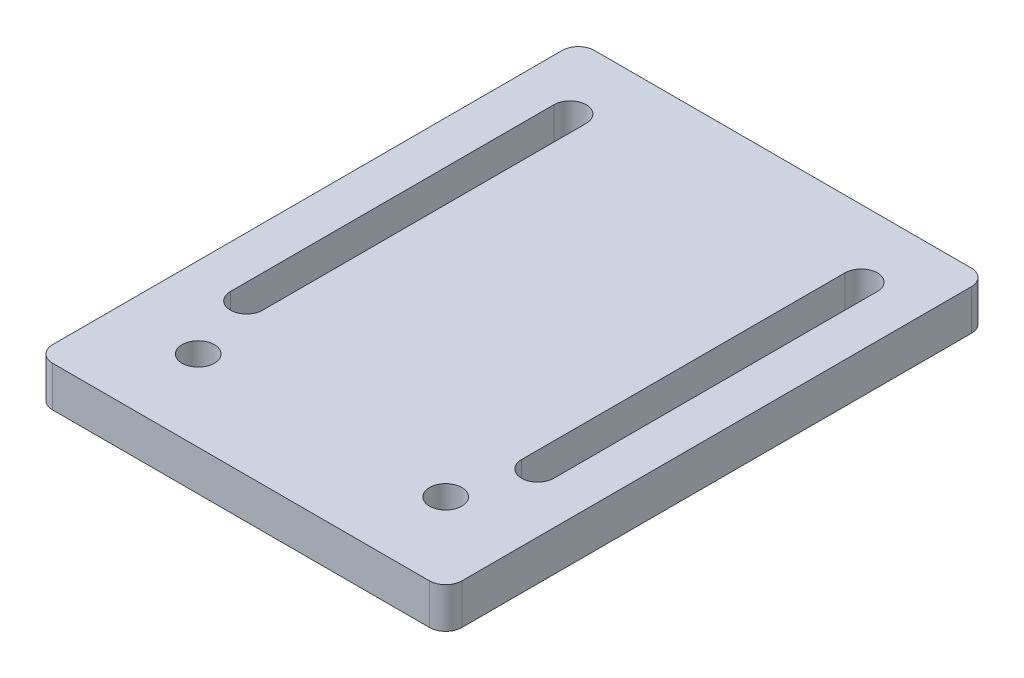
ISO-10303-21;
HEADER;
FILE_DESCRIPTION(('STEP AP214'),'2;1');
FILE_NAME('part.step','',(''),(''),'','','');
FILE_SCHEMA(('AUTOMOTIVE_DESIGN { 1 0 10303 214 1 1 1 1 }'));
ENDSEC;
DATA;
#1=APPLICATION_CONTEXT('core data for automotive mechanical design processes');
#2=APPLICATION_PROTOCOL_DEFINITION('international standard','automotive_design',2000,#1);
#3=PRODUCT_CONTEXT('',#1,'mechanical');
#4=PRODUCT('Part','Part','',(#3));
#5=PRODUCT_RELATED_PRODUCT_CATEGORY('part','',(#4));
#6=PRODUCT_DEFINITION_FORMATION('','',#4);
#7=PRODUCT_DEFINITION_CONTEXT('part definition',#1,'design');
#8=PRODUCT_DEFINITION('design','',#6,#7);
#9=PRODUCT_DEFINITION_SHAPE('','',#8);
#10=(LENGTH_UNIT() NAMED_UNIT(*) SI_UNIT(.MILLI.,.METRE.));
#11=(NAMED_UNIT(*) PLANE_ANGLE_UNIT() SI_UNIT($,.RADIAN.));
#12=(NAMED_UNIT(*) SI_UNIT($,.STERADIAN.) SOLID_ANGLE_UNIT());
#13=UNCERTAINTY_MEASURE_WITH_UNIT(LENGTH_MEASURE(1.E-05),#10,'distance_accuracy_value','');
#14=(GEOMETRIC_REPRESENTATION_CONTEXT(3) GLOBAL_UNCERTAINTY_ASSIGNED_CONTEXT((#13)) GLOBAL_UNIT_ASSIGNED_CONTEXT((#10,
#11,#12)) REPRESENTATION_CONTEXT('',''));
#15=CARTESIAN_POINT('',(0.,0.,0.));
#16=DIRECTION('',(0.,0.,1.));
#17=DIRECTION('',(1.,0.,0.));
#18=AXIS2_PLACEMENT_3D('',#15,#16,#17);
#19=CARTESIAN_POINT('',(25.3,5.,0.));
#20=DIRECTION('',(1.,0.,0.));
#21=DIRECTION('',(0.,0.,-1.));
#22=AXIS2_PLACEMENT_3D('',#19,#20,#21);
#23=PLANE('',#22);
#24=DIRECTION('',(0.,0.,1.));
#25=VECTOR('',#24,1.);
#26=CARTESIAN_POINT('',(25.3,0.,0.));
#27=LINE('',#26,#25);
#28=CARTESIAN_POINT('',(25.3,0.,-15.));
#29=VERTEX_POINT('',#28);
#30=CARTESIAN_POINT('',(25.3,0.,48.));
#31=VERTEX_POINT('',#30);
#32=EDGE_CURVE('E212',#29,#31,#27,.T.);
#33=ORIENTED_EDGE('',*,*,#32,.F.);
#34=DIRECTION('',(0.,-1.,0.));
#35=VECTOR('',#34,1.);
#36=CARTESIAN_POINT('',(25.3,5.,-15.));
#37=LINE('',#36,#35);
#38=CARTESIAN_POINT('',(25.3,5.,-15.));
#39=VERTEX_POINT('',#38);
#40=EDGE_CURVE('E274',#29,#39,#37,.F.);
#41=ORIENTED_EDGE('',*,*,#40,.T.);
#42=DIRECTION('',(0.,0.,1.));
#43=VECTOR('',#42,1.);
#44=CARTESIAN_POINT('',(25.3,5.,0.));
#45=LINE('',#44,#43);
#46=CARTESIAN_POINT('',(25.3,5.,48.));
#47=VERTEX_POINT('',#46);
#48=EDGE_CURVE('E338',#39,#47,#45,.T.);
#49=ORIENTED_EDGE('',*,*,#48,.T.);
#50=DIRECTION('',(0.,-1.,0.));
#51=VECTOR('',#50,1.);
#52=CARTESIAN_POINT('',(25.3,0.,48.));
#53=LINE('',#52,#51);
#54=EDGE_CURVE('E270',#47,#31,#53,.T.);
#55=ORIENTED_EDGE('',*,*,#54,.T.);
#56=EDGE_LOOP('',(#33,#41,#49,#55));
#57=FACE_BOUND('',#56,.T.);
#58=ADVANCED_FACE('F45',(#57),#23,.T.);
#59=CARTESIAN_POINT('',(0.,5.,-17.));
#60=DIRECTION('',(0.,0.,1.));
#61=DIRECTION('',(1.,0.,0.));
#62=AXIS2_PLACEMENT_3D('',#59,#60,#61);
#63=PLANE('',#62);
#64=DIRECTION('',(-1.,0.,0.));
#65=VECTOR('',#64,1.);
#66=CARTESIAN_POINT('',(0.,0.,-17.));
#67=LINE('',#66,#65);
#68=CARTESIAN_POINT('',(23.3,0.,-17.));
#69=VERTEX_POINT('',#68);
#70=CARTESIAN_POINT('',(-23.3,0.,-17.));
#71=VERTEX_POINT('',#70);
#72=EDGE_CURVE('E221',#69,#71,#67,.T.);
#73=ORIENTED_EDGE('',*,*,#72,.T.);
#74=DIRECTION('',(0.,-1.,0.));
#75=VECTOR('',#74,1.);
#76=CARTESIAN_POINT('',(-23.3,5.,-17.));
#77=LINE('',#76,#75);
#78=CARTESIAN_POINT('',(-23.3,5.,-17.));
#79=VERTEX_POINT('',#78);
#80=EDGE_CURVE('E255',#71,#79,#77,.F.);
#81=ORIENTED_EDGE('',*,*,#80,.T.);
#82=DIRECTION('',(-1.,0.,0.));
#83=VECTOR('',#82,1.);
#84=CARTESIAN_POINT('',(0.,5.,-17.));
#85=LINE('',#84,#83);
#86=CARTESIAN_POINT('',(23.3,5.,-17.));
#87=VERTEX_POINT('',#86);
#88=EDGE_CURVE('E342',#87,#79,#85,.T.);
#89=ORIENTED_EDGE('',*,*,#88,.F.);
#90=DIRECTION('',(0.,-1.,0.));
#91=VECTOR('',#90,1.);
#92=CARTESIAN_POINT('',(23.3,0.,-17.));
#93=LINE('',#92,#91);
#94=EDGE_CURVE('E251',#87,#69,#93,.T.);
#95=ORIENTED_EDGE('',*,*,#94,.T.);
#96=EDGE_LOOP('',(#73,#81,#89,#95));
#97=FACE_BOUND('',#96,.T.);
#98=ADVANCED_FACE('F376',(#97),#63,.F.);
#99=CARTESIAN_POINT('',(-25.3,5.,0.));
#100=DIRECTION('',(1.,0.,0.));
#101=DIRECTION('',(0.,0.,-1.));
#102=AXIS2_PLACEMENT_3D('',#99,#100,#101);
#103=PLANE('',#102);
#104=DIRECTION('',(0.,0.,1.));
#105=VECTOR('',#104,1.);
#106=CARTESIAN_POINT('',(-25.3,5.,0.));
#107=LINE('',#106,#105);
#108=CARTESIAN_POINT('',(-25.3,5.,-15.));
#109=VERTEX_POINT('',#108);
#110=CARTESIAN_POINT('',(-25.3,5.,48.));
#111=VERTEX_POINT('',#110);
#112=EDGE_CURVE('E345',#109,#111,#107,.T.);
#113=ORIENTED_EDGE('',*,*,#112,.F.);
#114=DIRECTION('',(0.,-1.,0.));
#115=VECTOR('',#114,1.);
#116=CARTESIAN_POINT('',(-25.3,5.,-15.));
#117=LINE('',#116,#115);
#118=CARTESIAN_POINT('',(-25.3,0.,-15.));
#119=VERTEX_POINT('',#118);
#120=EDGE_CURVE('E237',#109,#119,#117,.T.);
#121=ORIENTED_EDGE('',*,*,#120,.T.);
#122=DIRECTION('',(0.,0.,1.));
#123=VECTOR('',#122,1.);
#124=CARTESIAN_POINT('',(-25.3,0.,0.));
#125=LINE('',#124,#123);
#126=CARTESIAN_POINT('',(-25.3,0.,48.));
#127=VERTEX_POINT('',#126);
#128=EDGE_CURVE('E225',#119,#127,#125,.T.);
#129=ORIENTED_EDGE('',*,*,#128,.T.);
#130=DIRECTION('',(0.,-1.,0.));
#131=VECTOR('',#130,1.);
#132=CARTESIAN_POINT('',(-25.3,5.,48.));
#133=LINE('',#132,#131);
#134=EDGE_CURVE('E234',#127,#111,#133,.F.);
#135=ORIENTED_EDGE('',*,*,#134,.T.);
#136=EDGE_LOOP('',(#113,#121,#129,#135));
#137=FACE_BOUND('',#136,.T.);
#138=ADVANCED_FACE('F380',(#137),#103,.F.);
#139=CARTESIAN_POINT('',(-15.3,5.,40.));
#140=DIRECTION('',(0.,-1.,0.));
#141=DIRECTION('',(0.,0.,-1.));
#142=AXIS2_PLACEMENT_3D('',#139,#140,#141);
#143=CYLINDRICAL_SURFACE('',#142,2.);
#144=CARTESIAN_POINT('',(-15.3,5.,40.));
#145=DIRECTION('',(0.,1.,0.));
#146=DIRECTION('',(0.,0.,1.));
#147=AXIS2_PLACEMENT_3D('',#144,#145,#146);
#148=CIRCLE('',#147,2.);
#149=CARTESIAN_POINT('',(-15.3,5.,42.));
#150=VERTEX_POINT('',#149);
#151=EDGE_CURVE('E334',#150,#150,#148,.T.);
#152=ORIENTED_EDGE('',*,*,#151,.T.);
#153=EDGE_LOOP('',(#152));
#154=FACE_BOUND('',#153,.T.);
#155=CARTESIAN_POINT('',(-15.3,0.,40.));
#156=DIRECTION('',(0.,1.,0.));
#157=DIRECTION('',(0.,0.,1.));
#158=AXIS2_PLACEMENT_3D('',#155,#156,#157);
#159=CIRCLE('',#158,2.);
#160=CARTESIAN_POINT('',(-15.3,0.,42.));
#161=VERTEX_POINT('',#160);
#162=EDGE_CURVE('E206',#161,#161,#159,.T.);
#163=ORIENTED_EDGE('',*,*,#162,.F.);
#164=EDGE_LOOP('',(#163));
#165=FACE_BOUND('',#164,.T.);
#166=ADVANCED_FACE('F393',(#154,#165),#143,.F.);
#167=CARTESIAN_POINT('',(15.3,5.,40.));
#168=DIRECTION('',(0.,-1.,0.));
#169=DIRECTION('',(0.,0.,-1.));
#170=AXIS2_PLACEMENT_3D('',#167,#168,#169);
#171=CYLINDRICAL_SURFACE('',#170,2.);
#172=CARTESIAN_POINT('',(15.3,5.,40.));
#173=DIRECTION('',(0.,1.,0.));
#174=DIRECTION('',(0.,0.,1.));
#175=AXIS2_PLACEMENT_3D('',#172,#173,#174);
#176=CIRCLE('',#175,2.);
#177=CARTESIAN_POINT('',(15.3,5.,42.));
#178=VERTEX_POINT('',#177);
#179=EDGE_CURVE('E233',#178,#178,#176,.T.);
#180=ORIENTED_EDGE('',*,*,#179,.T.);
#181=EDGE_LOOP('',(#180));
#182=FACE_BOUND('',#181,.T.);
#183=CARTESIAN_POINT('',(15.3,0.,40.));
#184=DIRECTION('',(0.,1.,0.));
#185=DIRECTION('',(0.,0.,1.));
#186=AXIS2_PLACEMENT_3D('',#183,#184,#185);
#187=CIRCLE('',#186,2.);
#188=CARTESIAN_POINT('',(15.3,0.,42.));
#189=VERTEX_POINT('',#188);
#190=EDGE_CURVE('E200',#189,#189,#187,.T.);
#191=ORIENTED_EDGE('',*,*,#190,.F.);
#192=EDGE_LOOP('',(#191));
#193=FACE_BOUND('',#192,.T.);
#194=ADVANCED_FACE('F385',(#182,#193),#171,.F.);
#195=CARTESIAN_POINT('',(0.,5.,50.));
#196=DIRECTION('',(0.,0.,-1.));
#197=DIRECTION('',(-1.,0.,0.));
#198=AXIS2_PLACEMENT_3D('',#195,#196,#197);
#199=PLANE('',#198);
#200=DIRECTION('',(1.,0.,0.));
#201=VECTOR('',#200,1.);
#202=CARTESIAN_POINT('',(0.,0.,50.));
#203=LINE('',#202,#201);
#204=CARTESIAN_POINT('',(-23.3,0.,50.));
#205=VERTEX_POINT('',#204);
#206=CARTESIAN_POINT('',(23.3,0.,50.));
#207=VERTEX_POINT('',#206);
#208=EDGE_CURVE('E229',#205,#207,#203,.T.);
#209=ORIENTED_EDGE('',*,*,#208,.T.);
#210=DIRECTION('',(0.,-1.,0.));
#211=VECTOR('',#210,1.);
#212=CARTESIAN_POINT('',(23.3,5.,50.));
#213=LINE('',#212,#211);
#214=CARTESIAN_POINT('',(23.3,5.,50.));
#215=VERTEX_POINT('',#214);
#216=EDGE_CURVE('E11',#207,#215,#213,.F.);
#217=ORIENTED_EDGE('',*,*,#216,.T.);
#218=DIRECTION('',(1.,0.,0.));
#219=VECTOR('',#218,1.);
#220=CARTESIAN_POINT('',(0.,5.,50.));
#221=LINE('',#220,#219);
#222=CARTESIAN_POINT('',(-23.3,5.,50.));
#223=VERTEX_POINT('',#222);
#224=EDGE_CURVE('E215',#223,#215,#221,.T.);
#225=ORIENTED_EDGE('',*,*,#224,.F.);
#226=DIRECTION('',(0.,-1.,0.));
#227=VECTOR('',#226,1.);
#228=CARTESIAN_POINT('',(-23.3,5.,50.));
#229=LINE('',#228,#227);
#230=EDGE_CURVE('E55',#223,#205,#229,.T.);
#231=ORIENTED_EDGE('',*,*,#230,.T.);
#232=EDGE_LOOP('',(#209,#217,#225,#231));
#233=FACE_BOUND('',#232,.T.);
#234=ADVANCED_FACE('F383',(#233),#199,.F.);
#235=CARTESIAN_POINT('',(0.,5.,0.));
#236=DIRECTION('',(0.,1.,0.));
#237=DIRECTION('',(0.,0.,1.));
#238=AXIS2_PLACEMENT_3D('',#235,#236,#237);
#239=PLANE('',#238);
#240=CARTESIAN_POINT('',(18.,5.,-8.67891250614782));
#241=DIRECTION('',(0.,1.,0.));
#242=DIRECTION('',(0.,0.,1.));
#243=AXIS2_PLACEMENT_3D('',#240,#241,#242);
#244=CIRCLE('',#243,2.);
#245=CARTESIAN_POINT('',(20.,5.,-8.67891250614782));
#246=VERTEX_POINT('',#245);
#247=CARTESIAN_POINT('',(16.,5.,-8.67891250614782));
#248=VERTEX_POINT('',#247);
#249=EDGE_CURVE('E49',#246,#248,#244,.T.);
#250=ORIENTED_EDGE('',*,*,#249,.F.);
#251=DIRECTION('',(0.,0.,-1.));
#252=VECTOR('',#251,1.);
#253=CARTESIAN_POINT('',(20.,5.,-8.67891250614782));
#254=LINE('',#253,#252);
#255=CARTESIAN_POINT('',(20.,5.,31.3210874938522));
#256=VERTEX_POINT('',#255);
#257=EDGE_CURVE('E92',#256,#246,#254,.T.);
#258=ORIENTED_EDGE('',*,*,#257,.F.);
#259=CARTESIAN_POINT('',(18.,5.,31.3210874938522));
#260=DIRECTION('',(0.,1.,0.));
#261=DIRECTION('',(0.,0.,1.));
#262=AXIS2_PLACEMENT_3D('',#259,#260,#261);
#263=CIRCLE('',#262,2.);
#264=CARTESIAN_POINT('',(16.,5.,31.3210874938522));
#265=VERTEX_POINT('',#264);
#266=EDGE_CURVE('E193',#265,#256,#263,.T.);
#267=ORIENTED_EDGE('',*,*,#266,.F.);
#268=DIRECTION('',(0.,0.,1.));
#269=VECTOR('',#268,1.);
#270=CARTESIAN_POINT('',(16.,5.,-8.67891250614782));
#271=LINE('',#270,#269);
#272=EDGE_CURVE('E190',#248,#265,#271,.T.);
#273=ORIENTED_EDGE('',*,*,#272,.F.);
#274=EDGE_LOOP('',(#250,#258,#267,#273));
#275=FACE_BOUND('',#274,.T.);
#276=CARTESIAN_POINT('',(-18.,5.,-8.67891250614782));
#277=DIRECTION('',(0.,1.,0.));
#278=DIRECTION('',(0.,0.,1.));
#279=AXIS2_PLACEMENT_3D('',#276,#277,#278);
#280=CIRCLE('',#279,2.);
#281=CARTESIAN_POINT('',(-16.,5.,-8.67891250614782));
#282=VERTEX_POINT('',#281);
#283=CARTESIAN_POINT('',(-20.,5.,-8.67891250614782));
#284=VERTEX_POINT('',#283);
#285=EDGE_CURVE('E176',#282,#284,#280,.T.);
#286=ORIENTED_EDGE('',*,*,#285,.F.);
#287=DIRECTION('',(0.,0.,-1.));
#288=VECTOR('',#287,1.);
#289=CARTESIAN_POINT('',(-16.,5.,-8.67891250614782));
#290=LINE('',#289,#288);
#291=CARTESIAN_POINT('',(-16.,5.,31.3210874938522));
#292=VERTEX_POINT('',#291);
#293=EDGE_CURVE('E165',#292,#282,#290,.T.);
#294=ORIENTED_EDGE('',*,*,#293,.F.);
#295=CARTESIAN_POINT('',(-18.,5.,31.3210874938522));
#296=DIRECTION('',(0.,1.,0.));
#297=DIRECTION('',(0.,0.,1.));
#298=AXIS2_PLACEMENT_3D('',#295,#296,#297);
#299=CIRCLE('',#298,2.);
#300=CARTESIAN_POINT('',(-20.,5.,31.3210874938522));
#301=VERTEX_POINT('',#300);
#302=EDGE_CURVE('E159',#301,#292,#299,.T.);
#303=ORIENTED_EDGE('',*,*,#302,.F.);
#304=DIRECTION('',(0.,0.,1.));
#305=VECTOR('',#304,1.);
#306=CARTESIAN_POINT('',(-20.,5.,-8.67891250614782));
#307=LINE('',#306,#305);
#308=EDGE_CURVE('E188',#284,#301,#307,.T.);
#309=ORIENTED_EDGE('',*,*,#308,.F.);
#310=EDGE_LOOP('',(#286,#294,#303,#309));
#311=FACE_BOUND('',#310,.T.);
#312=ORIENTED_EDGE('',*,*,#179,.F.);
#313=EDGE_LOOP('',(#312));
#314=FACE_BOUND('',#313,.T.);
#315=ORIENTED_EDGE('',*,*,#151,.F.);
#316=EDGE_LOOP('',(#315));
#317=FACE_BOUND('',#316,.T.);
#318=ORIENTED_EDGE('',*,*,#88,.T.);
#319=CARTESIAN_POINT('',(-23.3,5.,-15.));
#320=DIRECTION('',(0.,1.,0.));
#321=DIRECTION('',(0.,0.,1.));
#322=AXIS2_PLACEMENT_3D('',#319,#320,#321);
#323=CIRCLE('',#322,2.);
#324=EDGE_CURVE('E267',#79,#109,#323,.T.);
#325=ORIENTED_EDGE('',*,*,#324,.T.);
#326=ORIENTED_EDGE('',*,*,#112,.T.);
#327=CARTESIAN_POINT('',(-23.3,5.,48.));
#328=DIRECTION('',(0.,1.,0.));
#329=DIRECTION('',(0.,0.,1.));
#330=AXIS2_PLACEMENT_3D('',#327,#328,#329);
#331=CIRCLE('',#330,2.);
#332=EDGE_CURVE('E258',#111,#223,#331,.T.);
#333=ORIENTED_EDGE('',*,*,#332,.T.);
#334=ORIENTED_EDGE('',*,*,#224,.T.);
#335=CARTESIAN_POINT('',(23.3,5.,48.));
#336=DIRECTION('',(0.,1.,0.));
#337=DIRECTION('',(0.,0.,1.));
#338=AXIS2_PLACEMENT_3D('',#335,#336,#337);
#339=CIRCLE('',#338,2.);
#340=EDGE_CURVE('E261',#215,#47,#339,.T.);
#341=ORIENTED_EDGE('',*,*,#340,.T.);
#342=ORIENTED_EDGE('',*,*,#48,.F.);
#343=CARTESIAN_POINT('',(23.3,5.,-15.));
#344=DIRECTION('',(0.,1.,0.));
#345=DIRECTION('',(0.,0.,1.));
#346=AXIS2_PLACEMENT_3D('',#343,#344,#345);
#347=CIRCLE('',#346,2.);
#348=EDGE_CURVE('E264',#39,#87,#347,.T.);
#349=ORIENTED_EDGE('',*,*,#348,.T.);
#350=EDGE_LOOP('',(#318,#325,#326,#333,#334,#341,#342,#349));
#351=FACE_BOUND('',#350,.T.);
#352=ADVANCED_FACE('F186',(#275,#311,#314,#317,#351),#239,.T.);
#353=CARTESIAN_POINT('',(0.,0.,0.));
#354=DIRECTION('',(0.,1.,0.));
#355=DIRECTION('',(0.,0.,1.));
#356=AXIS2_PLACEMENT_3D('',#353,#354,#355);
#357=PLANE('',#356);
#358=DIRECTION('',(0.,0.,-1.));
#359=VECTOR('',#358,1.);
#360=CARTESIAN_POINT('',(20.,0.,-8.67891250614782));
#361=LINE('',#360,#359);
#362=CARTESIAN_POINT('',(20.,0.,31.3210874938522));
#363=VERTEX_POINT('',#362);
#364=CARTESIAN_POINT('',(20.,0.,-8.67891250614782));
#365=VERTEX_POINT('',#364);
#366=EDGE_CURVE('E294',#363,#365,#361,.T.);
#367=ORIENTED_EDGE('',*,*,#366,.T.);
#368=CARTESIAN_POINT('',(18.,0.,-8.67891250614782));
#369=DIRECTION('',(0.,1.,0.));
#370=DIRECTION('',(0.,0.,1.));
#371=AXIS2_PLACEMENT_3D('',#368,#369,#370);
#372=CIRCLE('',#371,2.);
#373=CARTESIAN_POINT('',(16.,0.,-8.67891250614782));
#374=VERTEX_POINT('',#373);
#375=EDGE_CURVE('E306',#365,#374,#372,.T.);
#376=ORIENTED_EDGE('',*,*,#375,.T.);
#377=DIRECTION('',(0.,0.,1.));
#378=VECTOR('',#377,1.);
#379=CARTESIAN_POINT('',(16.,0.,-8.67891250614782));
#380=LINE('',#379,#378);
#381=CARTESIAN_POINT('',(16.,0.,31.3210874938522));
#382=VERTEX_POINT('',#381);
#383=EDGE_CURVE('E302',#374,#382,#380,.T.);
#384=ORIENTED_EDGE('',*,*,#383,.T.);
#385=CARTESIAN_POINT('',(18.,0.,31.3210874938522));
#386=DIRECTION('',(0.,1.,0.));
#387=DIRECTION('',(0.,0.,1.));
#388=AXIS2_PLACEMENT_3D('',#385,#386,#387);
#389=CIRCLE('',#388,2.);
#390=EDGE_CURVE('E298',#382,#363,#389,.T.);
#391=ORIENTED_EDGE('',*,*,#390,.T.);
#392=EDGE_LOOP('',(#367,#376,#384,#391));
#393=FACE_BOUND('',#392,.T.);
#394=DIRECTION('',(0.,0.,-1.));
#395=VECTOR('',#394,1.);
#396=CARTESIAN_POINT('',(-16.,0.,-8.67891250614782));
#397=LINE('',#396,#395);
#398=CARTESIAN_POINT('',(-16.,0.,31.3210874938522));
#399=VERTEX_POINT('',#398);
#400=CARTESIAN_POINT('',(-16.,0.,-8.67891250614782));
#401=VERTEX_POINT('',#400);
#402=EDGE_CURVE('E320',#399,#401,#397,.T.);
#403=ORIENTED_EDGE('',*,*,#402,.T.);
#404=CARTESIAN_POINT('',(-18.,0.,-8.67891250614782));
#405=DIRECTION('',(0.,1.,0.));
#406=DIRECTION('',(0.,0.,-1.));
#407=AXIS2_PLACEMENT_3D('',#404,#405,#406);
#408=CIRCLE('',#407,2.);
#409=CARTESIAN_POINT('',(-20.,0.,-8.67891250614782));
#410=VERTEX_POINT('',#409);
#411=EDGE_CURVE('E182',#401,#410,#408,.T.);
#412=ORIENTED_EDGE('',*,*,#411,.T.);
#413=DIRECTION('',(0.,0.,1.));
#414=VECTOR('',#413,1.);
#415=CARTESIAN_POINT('',(-20.,0.,-8.67891250614782));
#416=LINE('',#415,#414);
#417=CARTESIAN_POINT('',(-20.,0.,31.3210874938522));
#418=VERTEX_POINT('',#417);
#419=EDGE_CURVE('E312',#410,#418,#416,.T.);
#420=ORIENTED_EDGE('',*,*,#419,.T.);
#421=CARTESIAN_POINT('',(-18.,0.,31.3210874938522));
#422=DIRECTION('',(0.,1.,0.));
#423=DIRECTION('',(0.,0.,-1.));
#424=AXIS2_PLACEMENT_3D('',#421,#422,#423);
#425=CIRCLE('',#424,2.);
#426=EDGE_CURVE('E316',#418,#399,#425,.T.);
#427=ORIENTED_EDGE('',*,*,#426,.T.);
#428=EDGE_LOOP('',(#403,#412,#420,#427));
#429=FACE_BOUND('',#428,.T.);
#430=ORIENTED_EDGE('',*,*,#190,.T.);
#431=EDGE_LOOP('',(#430));
#432=FACE_BOUND('',#431,.T.);
#433=ORIENTED_EDGE('',*,*,#162,.T.);
#434=EDGE_LOOP('',(#433));
#435=FACE_BOUND('',#434,.T.);
#436=ORIENTED_EDGE('',*,*,#128,.F.);
#437=CARTESIAN_POINT('',(-23.3,0.,-15.));
#438=DIRECTION('',(0.,1.,0.));
#439=DIRECTION('',(0.,0.,1.));
#440=AXIS2_PLACEMENT_3D('',#437,#438,#439);
#441=CIRCLE('',#440,2.);
#442=EDGE_CURVE('E101',#119,#71,#441,.F.);
#443=ORIENTED_EDGE('',*,*,#442,.T.);
#444=ORIENTED_EDGE('',*,*,#72,.F.);
#445=CARTESIAN_POINT('',(23.3,0.,-15.));
#446=DIRECTION('',(0.,1.,0.));
#447=DIRECTION('',(0.,0.,1.));
#448=AXIS2_PLACEMENT_3D('',#445,#446,#447);
#449=CIRCLE('',#448,2.);
#450=EDGE_CURVE('E246',#69,#29,#449,.F.);
#451=ORIENTED_EDGE('',*,*,#450,.T.);
#452=ORIENTED_EDGE('',*,*,#32,.T.);
#453=CARTESIAN_POINT('',(23.3,0.,48.));
#454=DIRECTION('',(0.,1.,0.));
#455=DIRECTION('',(0.,0.,1.));
#456=AXIS2_PLACEMENT_3D('',#453,#454,#455);
#457=CIRCLE('',#456,2.);
#458=EDGE_CURVE('E243',#31,#207,#457,.F.);
#459=ORIENTED_EDGE('',*,*,#458,.T.);
#460=ORIENTED_EDGE('',*,*,#208,.F.);
#461=CARTESIAN_POINT('',(-23.3,0.,48.));
#462=DIRECTION('',(0.,1.,0.));
#463=DIRECTION('',(0.,0.,1.));
#464=AXIS2_PLACEMENT_3D('',#461,#462,#463);
#465=CIRCLE('',#464,2.);
#466=EDGE_CURVE('E240',#205,#127,#465,.F.);
#467=ORIENTED_EDGE('',*,*,#466,.T.);
#468=EDGE_LOOP('',(#436,#443,#444,#451,#452,#459,#460,#467));
#469=FACE_BOUND('',#468,.T.);
#470=ADVANCED_FACE('F367',(#393,#429,#432,#435,#469),#357,.F.);
#471=CARTESIAN_POINT('',(-23.3,5.,-15.));
#472=DIRECTION('',(0.,-1.,0.));
#473=DIRECTION('',(0.,0.,-1.));
#474=AXIS2_PLACEMENT_3D('',#471,#472,#473);
#475=CYLINDRICAL_SURFACE('',#474,2.);
#476=ORIENTED_EDGE('',*,*,#324,.F.);
#477=ORIENTED_EDGE('',*,*,#80,.F.);
#478=ORIENTED_EDGE('',*,*,#442,.F.);
#479=ORIENTED_EDGE('',*,*,#120,.F.);
#480=EDGE_LOOP('',(#476,#477,#478,#479));
#481=FACE_BOUND('',#480,.T.);
#482=ADVANCED_FACE('F378',(#481),#475,.T.);
#483=CARTESIAN_POINT('',(23.3,5.,-15.));
#484=DIRECTION('',(0.,1.,0.));
#485=DIRECTION('',(0.,0.,1.));
#486=AXIS2_PLACEMENT_3D('',#483,#484,#485);
#487=CYLINDRICAL_SURFACE('',#486,2.);
#488=ORIENTED_EDGE('',*,*,#348,.F.);
#489=ORIENTED_EDGE('',*,*,#40,.F.);
#490=ORIENTED_EDGE('',*,*,#450,.F.);
#491=ORIENTED_EDGE('',*,*,#94,.F.);
#492=EDGE_LOOP('',(#488,#489,#490,#491));
#493=FACE_BOUND('',#492,.T.);
#494=ADVANCED_FACE('F373',(#493),#487,.T.);
#495=CARTESIAN_POINT('',(23.3,5.,48.));
#496=DIRECTION('',(0.,1.,0.));
#497=DIRECTION('',(0.,0.,1.));
#498=AXIS2_PLACEMENT_3D('',#495,#496,#497);
#499=CYLINDRICAL_SURFACE('',#498,2.);
#500=ORIENTED_EDGE('',*,*,#340,.F.);
#501=ORIENTED_EDGE('',*,*,#216,.F.);
#502=ORIENTED_EDGE('',*,*,#458,.F.);
#503=ORIENTED_EDGE('',*,*,#54,.F.);
#504=EDGE_LOOP('',(#500,#501,#502,#503));
#505=FACE_BOUND('',#504,.T.);
#506=ADVANCED_FACE('F361',(#505),#499,.T.);
#507=CARTESIAN_POINT('',(-23.3,5.,48.));
#508=DIRECTION('',(0.,-1.,0.));
#509=DIRECTION('',(0.,0.,-1.));
#510=AXIS2_PLACEMENT_3D('',#507,#508,#509);
#511=CYLINDRICAL_SURFACE('',#510,2.);
#512=ORIENTED_EDGE('',*,*,#332,.F.);
#513=ORIENTED_EDGE('',*,*,#134,.F.);
#514=ORIENTED_EDGE('',*,*,#466,.F.);
#515=ORIENTED_EDGE('',*,*,#230,.F.);
#516=EDGE_LOOP('',(#512,#513,#514,#515));
#517=FACE_BOUND('',#516,.T.);
#518=ADVANCED_FACE('F47',(#517),#511,.T.);
#519=CARTESIAN_POINT('',(-18.,0.,-8.67891250614782));
#520=DIRECTION('',(0.,1.,0.));
#521=DIRECTION('',(0.,0.,1.));
#522=AXIS2_PLACEMENT_3D('',#519,#520,#521);
#523=CYLINDRICAL_SURFACE('',#522,2.);
#524=ORIENTED_EDGE('',*,*,#285,.T.);
#525=DIRECTION('',(0.,1.,0.));
#526=VECTOR('',#525,1.);
#527=CARTESIAN_POINT('',(-20.,0.,-8.67891250614782));
#528=LINE('',#527,#526);
#529=EDGE_CURVE('E72',#410,#284,#528,.T.);
#530=ORIENTED_EDGE('',*,*,#529,.F.);
#531=ORIENTED_EDGE('',*,*,#411,.F.);
#532=DIRECTION('',(0.,1.,0.));
#533=VECTOR('',#532,1.);
#534=CARTESIAN_POINT('',(-16.,0.,-8.67891250614782));
#535=LINE('',#534,#533);
#536=EDGE_CURVE('E170',#401,#282,#535,.T.);
#537=ORIENTED_EDGE('',*,*,#536,.T.);
#538=EDGE_LOOP('',(#524,#530,#531,#537));
#539=FACE_BOUND('',#538,.T.);
#540=ADVANCED_FACE('F179',(#539),#523,.F.);
#541=CARTESIAN_POINT('',(-16.,0.,-8.67891250614782));
#542=DIRECTION('',(1.,0.,0.));
#543=DIRECTION('',(0.,0.,-1.));
#544=AXIS2_PLACEMENT_3D('',#541,#542,#543);
#545=PLANE('',#544);
#546=ORIENTED_EDGE('',*,*,#293,.T.);
#547=ORIENTED_EDGE('',*,*,#536,.F.);
#548=ORIENTED_EDGE('',*,*,#402,.F.);
#549=DIRECTION('',(0.,1.,0.));
#550=VECTOR('',#549,1.);
#551=CARTESIAN_POINT('',(-16.,0.,31.3210874938522));
#552=LINE('',#551,#550);
#553=EDGE_CURVE('E172',#399,#292,#552,.T.);
#554=ORIENTED_EDGE('',*,*,#553,.T.);
#555=EDGE_LOOP('',(#546,#547,#548,#554));
#556=FACE_BOUND('',#555,.T.);
#557=ADVANCED_FACE('F167',(#556),#545,.F.);
#558=CARTESIAN_POINT('',(-18.,0.,31.3210874938522));
#559=DIRECTION('',(0.,1.,0.));
#560=DIRECTION('',(0.,0.,1.));
#561=AXIS2_PLACEMENT_3D('',#558,#559,#560);
#562=CYLINDRICAL_SURFACE('',#561,2.);
#563=ORIENTED_EDGE('',*,*,#302,.T.);
#564=ORIENTED_EDGE('',*,*,#553,.F.);
#565=ORIENTED_EDGE('',*,*,#426,.F.);
#566=DIRECTION('',(0.,1.,0.));
#567=VECTOR('',#566,1.);
#568=CARTESIAN_POINT('',(-20.,0.,31.3210874938522));
#569=LINE('',#568,#567);
#570=EDGE_CURVE('E325',#418,#301,#569,.T.);
#571=ORIENTED_EDGE('',*,*,#570,.T.);
#572=EDGE_LOOP('',(#563,#564,#565,#571));
#573=FACE_BOUND('',#572,.T.);
#574=ADVANCED_FACE('F422',(#573),#562,.F.);
#575=CARTESIAN_POINT('',(-20.,0.,-8.67891250614782));
#576=DIRECTION('',(-1.,0.,0.));
#577=DIRECTION('',(0.,0.,1.));
#578=AXIS2_PLACEMENT_3D('',#575,#576,#577);
#579=PLANE('',#578);
#580=ORIENTED_EDGE('',*,*,#308,.T.);
#581=ORIENTED_EDGE('',*,*,#570,.F.);
#582=ORIENTED_EDGE('',*,*,#419,.F.);
#583=ORIENTED_EDGE('',*,*,#529,.T.);
#584=EDGE_LOOP('',(#580,#581,#582,#583));
#585=FACE_BOUND('',#584,.T.);
#586=ADVANCED_FACE('F428',(#585),#579,.F.);
#587=CARTESIAN_POINT('',(18.,0.,-8.67891250614782));
#588=DIRECTION('',(0.,1.,0.));
#589=DIRECTION('',(0.,0.,1.));
#590=AXIS2_PLACEMENT_3D('',#587,#588,#589);
#591=CYLINDRICAL_SURFACE('',#590,2.);
#592=ORIENTED_EDGE('',*,*,#249,.T.);
#593=DIRECTION('',(0.,1.,0.));
#594=VECTOR('',#593,1.);
#595=CARTESIAN_POINT('',(16.,0.,-8.67891250614782));
#596=LINE('',#595,#594);
#597=EDGE_CURVE('E63',#374,#248,#596,.T.);
#598=ORIENTED_EDGE('',*,*,#597,.F.);
#599=ORIENTED_EDGE('',*,*,#375,.F.);
#600=DIRECTION('',(0.,1.,0.));
#601=VECTOR('',#600,1.);
#602=CARTESIAN_POINT('',(20.,0.,-8.67891250614782));
#603=LINE('',#602,#601);
#604=EDGE_CURVE('E281',#365,#246,#603,.T.);
#605=ORIENTED_EDGE('',*,*,#604,.T.);
#606=EDGE_LOOP('',(#592,#598,#599,#605));
#607=FACE_BOUND('',#606,.T.);
#608=ADVANCED_FACE('F426',(#607),#591,.F.);
#609=CARTESIAN_POINT('',(20.,0.,-8.67891250614782));
#610=DIRECTION('',(1.,0.,0.));
#611=DIRECTION('',(0.,0.,-1.));
#612=AXIS2_PLACEMENT_3D('',#609,#610,#611);
#613=PLANE('',#612);
#614=ORIENTED_EDGE('',*,*,#257,.T.);
#615=ORIENTED_EDGE('',*,*,#604,.F.);
#616=ORIENTED_EDGE('',*,*,#366,.F.);
#617=DIRECTION('',(0.,1.,0.));
#618=VECTOR('',#617,1.);
#619=CARTESIAN_POINT('',(20.,0.,31.3210874938522));
#620=LINE('',#619,#618);
#621=EDGE_CURVE('E285',#363,#256,#620,.T.);
#622=ORIENTED_EDGE('',*,*,#621,.T.);
#623=EDGE_LOOP('',(#614,#615,#616,#622));
#624=FACE_BOUND('',#623,.T.);
#625=ADVANCED_FACE('F455',(#624),#613,.F.);
#626=CARTESIAN_POINT('',(18.,0.,31.3210874938522));
#627=DIRECTION('',(0.,1.,0.));
#628=DIRECTION('',(0.,0.,1.));
#629=AXIS2_PLACEMENT_3D('',#626,#627,#628);
#630=CYLINDRICAL_SURFACE('',#629,2.);
#631=ORIENTED_EDGE('',*,*,#266,.T.);
#632=ORIENTED_EDGE('',*,*,#621,.F.);
#633=ORIENTED_EDGE('',*,*,#390,.F.);
#634=DIRECTION('',(0.,1.,0.));
#635=VECTOR('',#634,1.);
#636=CARTESIAN_POINT('',(16.,0.,31.3210874938522));
#637=LINE('',#636,#635);
#638=EDGE_CURVE('E288',#382,#265,#637,.T.);
#639=ORIENTED_EDGE('',*,*,#638,.T.);
#640=EDGE_LOOP('',(#631,#632,#633,#639));
#641=FACE_BOUND('',#640,.T.);
#642=ADVANCED_FACE('F453',(#641),#630,.F.);
#643=CARTESIAN_POINT('',(16.,0.,-8.67891250614782));
#644=DIRECTION('',(-1.,0.,0.));
#645=DIRECTION('',(0.,0.,1.));
#646=AXIS2_PLACEMENT_3D('',#643,#644,#645);
#647=PLANE('',#646);
#648=ORIENTED_EDGE('',*,*,#272,.T.);
#649=ORIENTED_EDGE('',*,*,#638,.F.);
#650=ORIENTED_EDGE('',*,*,#383,.F.);
#651=ORIENTED_EDGE('',*,*,#597,.T.);
#652=EDGE_LOOP('',(#648,#649,#650,#651));
#653=FACE_BOUND('',#652,.T.);
#654=ADVANCED_FACE('F451',(#653),#647,.F.);
#655=CLOSED_SHELL('',(#58,#98,#138,#166,#194,#234,#352,#470,#482,#494,#506,#518,#540,#557,#574,
#586,#608,#625,#642,#654));
#656=MANIFOLD_SOLID_BREP('B2',#655);
#657=ADVANCED_BREP_SHAPE_REPRESENTATION('',(#18,#656),#14);
#658=SHAPE_DEFINITION_REPRESENTATION(#9,#657);
ENDSEC;
END-ISO-10303-21;
